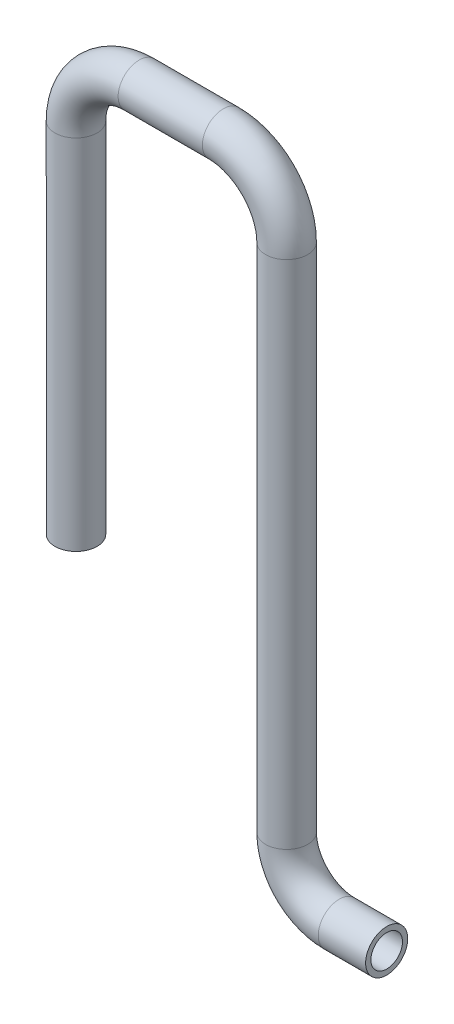
ISO-10303-21;
HEADER;
FILE_DESCRIPTION(('STEP AP214'),'2;1');
FILE_NAME('part.step','',(''),(''),'','','');
FILE_SCHEMA(('AUTOMOTIVE_DESIGN { 1 0 10303 214 1 1 1 1 }'));
ENDSEC;
DATA;
#1=APPLICATION_CONTEXT('core data for automotive mechanical design processes');
#2=APPLICATION_PROTOCOL_DEFINITION('international standard','automotive_design',2000,#1);
#3=PRODUCT_CONTEXT('',#1,'mechanical');
#4=PRODUCT('Part','Part','',(#3));
#5=PRODUCT_RELATED_PRODUCT_CATEGORY('part','',(#4));
#6=PRODUCT_DEFINITION_FORMATION('','',#4);
#7=PRODUCT_DEFINITION_CONTEXT('part definition',#1,'design');
#8=PRODUCT_DEFINITION('design','',#6,#7);
#9=PRODUCT_DEFINITION_SHAPE('','',#8);
#10=(LENGTH_UNIT() NAMED_UNIT(*) SI_UNIT(.MILLI.,.METRE.));
#11=(NAMED_UNIT(*) PLANE_ANGLE_UNIT() SI_UNIT($,.RADIAN.));
#12=(NAMED_UNIT(*) SI_UNIT($,.STERADIAN.) SOLID_ANGLE_UNIT());
#13=UNCERTAINTY_MEASURE_WITH_UNIT(LENGTH_MEASURE(1.E-05),#10,'distance_accuracy_value','');
#14=(GEOMETRIC_REPRESENTATION_CONTEXT(3) GLOBAL_UNCERTAINTY_ASSIGNED_CONTEXT((#13)) GLOBAL_UNIT_ASSIGNED_CONTEXT((#10,
#11,#12)) REPRESENTATION_CONTEXT('',''));
#15=CARTESIAN_POINT('',(0.,0.,0.));
#16=DIRECTION('',(0.,0.,1.));
#17=DIRECTION('',(1.,0.,0.));
#18=AXIS2_PLACEMENT_3D('',#15,#16,#17);
#19=CARTESIAN_POINT('',(59.,21.,35.));
#20=DIRECTION('',(1.,0.,0.));
#21=DIRECTION('',(0.,0.,1.));
#22=AXIS2_PLACEMENT_3D('',#19,#20,#21);
#23=PLANE('',#22);
#24=CARTESIAN_POINT('',(59.,21.,35.));
#25=DIRECTION('',(1.,0.,0.));
#26=DIRECTION('',(0.,0.,1.));
#27=AXIS2_PLACEMENT_3D('',#24,#25,#26);
#28=CIRCLE('',#27,3.);
#29=CARTESIAN_POINT('',(59.,21.,38.));
#30=VERTEX_POINT('',#29);
#31=EDGE_CURVE('E263',#30,#30,#28,.T.);
#32=ORIENTED_EDGE('',*,*,#31,.F.);
#33=EDGE_LOOP('',(#32));
#34=FACE_BOUND('',#33,.T.);
#35=CARTESIAN_POINT('',(59.,21.,35.));
#36=DIRECTION('',(1.,0.,0.));
#37=DIRECTION('',(0.,0.,-1.));
#38=AXIS2_PLACEMENT_3D('',#35,#36,#37);
#39=CIRCLE('',#38,4.);
#40=CARTESIAN_POINT('',(59.,21.,31.));
#41=VERTEX_POINT('',#40);
#42=EDGE_CURVE('E75',#41,#41,#39,.T.);
#43=ORIENTED_EDGE('',*,*,#42,.T.);
#44=EDGE_LOOP('',(#43));
#45=FACE_BOUND('',#44,.T.);
#46=ADVANCED_FACE('F52',(#34,#45),#23,.T.);
#47=CARTESIAN_POINT('',(0.,60.,35.));
#48=DIRECTION('',(0.,1.,0.));
#49=DIRECTION('',(0.,0.,1.));
#50=AXIS2_PLACEMENT_3D('',#47,#48,#49);
#51=PLANE('',#50);
#52=CARTESIAN_POINT('',(0.,60.,35.));
#53=DIRECTION('',(0.,1.,0.));
#54=DIRECTION('',(0.,0.,1.));
#55=AXIS2_PLACEMENT_3D('',#52,#53,#54);
#56=CIRCLE('',#55,3.);
#57=CARTESIAN_POINT('',(0.,60.,38.));
#58=VERTEX_POINT('',#57);
#59=EDGE_CURVE('E73',#58,#58,#56,.T.);
#60=ORIENTED_EDGE('',*,*,#59,.T.);
#61=EDGE_LOOP('',(#60));
#62=FACE_BOUND('',#61,.T.);
#63=CARTESIAN_POINT('',(0.,60.,35.));
#64=DIRECTION('',(0.,1.,0.));
#65=DIRECTION('',(0.,0.,1.));
#66=AXIS2_PLACEMENT_3D('',#63,#64,#65);
#67=CIRCLE('',#66,4.);
#68=CARTESIAN_POINT('',(0.,60.,39.));
#69=VERTEX_POINT('',#68);
#70=EDGE_CURVE('E11',#69,#69,#67,.T.);
#71=ORIENTED_EDGE('',*,*,#70,.F.);
#72=EDGE_LOOP('',(#71));
#73=FACE_BOUND('',#72,.T.);
#74=ADVANCED_FACE('F149',(#62,#73),#51,.F.);
#75=CARTESIAN_POINT('',(59.,21.,35.));
#76=DIRECTION('',(-1.,0.,0.));
#77=DIRECTION('',(0.,0.,1.));
#78=AXIS2_PLACEMENT_3D('',#75,#76,#77);
#79=CYLINDRICAL_SURFACE('',#78,4.);
#80=CARTESIAN_POINT('',(50.,21.,35.));
#81=DIRECTION('',(-1.,0.,0.));
#82=DIRECTION('',(0.,0.,1.));
#83=AXIS2_PLACEMENT_3D('',#80,#81,#82);
#84=CIRCLE('',#83,4.);
#85=CARTESIAN_POINT('',(50.,17.,35.));
#86=VERTEX_POINT('',#85);
#87=EDGE_CURVE('E74',#86,#86,#84,.F.);
#88=ORIENTED_EDGE('',*,*,#87,.T.);
#89=EDGE_LOOP('',(#88));
#90=FACE_BOUND('',#89,.T.);
#91=ORIENTED_EDGE('',*,*,#42,.F.);
#92=EDGE_LOOP('',(#91));
#93=FACE_BOUND('',#92,.T.);
#94=ADVANCED_FACE('F155',(#90,#93),#79,.T.);
#95=CARTESIAN_POINT('',(50.,31.,35.));
#96=DIRECTION('',(0.,0.,-1.));
#97=DIRECTION('',(-1.,0.,0.));
#98=AXIS2_PLACEMENT_3D('',#95,#96,#97);
#99=TOROIDAL_SURFACE('',#98,10.,4.);
#100=CARTESIAN_POINT('',(40.,31.,35.));
#101=DIRECTION('',(0.,-1.,0.));
#102=DIRECTION('',(0.,0.,-1.));
#103=AXIS2_PLACEMENT_3D('',#100,#101,#102);
#104=CIRCLE('',#103,4.);
#105=CARTESIAN_POINT('',(36.,31.,35.));
#106=VERTEX_POINT('',#105);
#107=EDGE_CURVE('E78',#106,#106,#104,.T.);
#108=CARTESIAN_POINT('',(50.,31.,35.));
#109=DIRECTION('',(0.,0.,-1.));
#110=DIRECTION('',(-1.,0.,0.));
#111=AXIS2_PLACEMENT_3D('',#108,#109,#110);
#112=CIRCLE('',#111,14.);
#113=EDGE_CURVE('',#86,#106,#112,.T.);
#114=ORIENTED_EDGE('',*,*,#87,.F.);
#115=ORIENTED_EDGE('',*,*,#107,.T.);
#116=ORIENTED_EDGE('',*,*,#113,.T.);
#117=ORIENTED_EDGE('',*,*,#113,.F.);
#118=EDGE_LOOP('',(#114,#116,#115,#117));
#119=FACE_BOUND('',#118,.T.);
#120=ADVANCED_FACE('F158',(#119),#99,.T.);
#121=CARTESIAN_POINT('',(40.,31.,35.));
#122=DIRECTION('',(0.,1.,0.));
#123=DIRECTION('',(0.,0.,1.));
#124=AXIS2_PLACEMENT_3D('',#121,#122,#123);
#125=CYLINDRICAL_SURFACE('',#124,4.);
#126=CARTESIAN_POINT('',(40.,128.,35.));
#127=DIRECTION('',(0.,1.,0.));
#128=DIRECTION('',(0.,0.,1.));
#129=AXIS2_PLACEMENT_3D('',#126,#127,#128);
#130=CIRCLE('',#129,4.);
#131=CARTESIAN_POINT('',(44.,128.,35.));
#132=VERTEX_POINT('',#131);
#133=EDGE_CURVE('E91',#132,#132,#130,.F.);
#134=ORIENTED_EDGE('',*,*,#133,.T.);
#135=EDGE_LOOP('',(#134));
#136=FACE_BOUND('',#135,.T.);
#137=ORIENTED_EDGE('',*,*,#107,.F.);
#138=EDGE_LOOP('',(#137));
#139=FACE_BOUND('',#138,.T.);
#140=ADVANCED_FACE('F109',(#136,#139),#125,.T.);
#141=CARTESIAN_POINT('',(28.,128.,35.));
#142=DIRECTION('',(0.,0.,1.));
#143=DIRECTION('',(1.,0.,0.));
#144=AXIS2_PLACEMENT_3D('',#141,#142,#143);
#145=TOROIDAL_SURFACE('',#144,12.,4.);
#146=CARTESIAN_POINT('',(28.,140.,35.));
#147=DIRECTION('',(1.,0.,0.));
#148=DIRECTION('',(0.,1.,0.));
#149=AXIS2_PLACEMENT_3D('',#146,#147,#148);
#150=CIRCLE('',#149,4.);
#151=CARTESIAN_POINT('',(28.,144.,35.));
#152=VERTEX_POINT('',#151);
#153=EDGE_CURVE('E67',#152,#152,#150,.T.);
#154=CARTESIAN_POINT('',(28.,128.,35.));
#155=DIRECTION('',(0.,0.,1.));
#156=DIRECTION('',(1.,0.,0.));
#157=AXIS2_PLACEMENT_3D('',#154,#155,#156);
#158=CIRCLE('',#157,16.);
#159=EDGE_CURVE('',#132,#152,#158,.T.);
#160=ORIENTED_EDGE('',*,*,#133,.F.);
#161=ORIENTED_EDGE('',*,*,#153,.T.);
#162=ORIENTED_EDGE('',*,*,#159,.T.);
#163=ORIENTED_EDGE('',*,*,#159,.F.);
#164=EDGE_LOOP('',(#160,#162,#161,#163));
#165=FACE_BOUND('',#164,.T.);
#166=ADVANCED_FACE('F98',(#165),#145,.T.);
#167=CARTESIAN_POINT('',(28.,140.,35.));
#168=DIRECTION('',(-1.,0.,0.));
#169=DIRECTION('',(0.,0.,1.));
#170=AXIS2_PLACEMENT_3D('',#167,#168,#169);
#171=CYLINDRICAL_SURFACE('',#170,4.);
#172=CARTESIAN_POINT('',(12.,140.,35.));
#173=DIRECTION('',(-1.,0.,0.));
#174=DIRECTION('',(0.,0.,1.));
#175=AXIS2_PLACEMENT_3D('',#172,#173,#174);
#176=CIRCLE('',#175,4.);
#177=CARTESIAN_POINT('',(12.,144.,35.));
#178=VERTEX_POINT('',#177);
#179=EDGE_CURVE('E63',#178,#178,#176,.F.);
#180=ORIENTED_EDGE('',*,*,#179,.T.);
#181=EDGE_LOOP('',(#180));
#182=FACE_BOUND('',#181,.T.);
#183=ORIENTED_EDGE('',*,*,#153,.F.);
#184=EDGE_LOOP('',(#183));
#185=FACE_BOUND('',#184,.T.);
#186=ADVANCED_FACE('F101',(#182,#185),#171,.T.);
#187=CARTESIAN_POINT('',(12.,128.,35.));
#188=DIRECTION('',(0.,0.,1.));
#189=DIRECTION('',(1.,0.,0.));
#190=AXIS2_PLACEMENT_3D('',#187,#188,#189);
#191=TOROIDAL_SURFACE('',#190,12.,4.);
#192=CARTESIAN_POINT('',(0.,128.,35.));
#193=DIRECTION('',(0.,1.,0.));
#194=DIRECTION('',(-1.,0.,0.));
#195=AXIS2_PLACEMENT_3D('',#192,#193,#194);
#196=CIRCLE('',#195,4.);
#197=CARTESIAN_POINT('',(-4.00000000000001,128.,35.));
#198=VERTEX_POINT('',#197);
#199=EDGE_CURVE('E58',#198,#198,#196,.T.);
#200=CARTESIAN_POINT('',(12.,128.,35.));
#201=DIRECTION('',(0.,0.,1.));
#202=DIRECTION('',(1.,0.,0.));
#203=AXIS2_PLACEMENT_3D('',#200,#201,#202);
#204=CIRCLE('',#203,16.);
#205=EDGE_CURVE('',#178,#198,#204,.T.);
#206=ORIENTED_EDGE('',*,*,#179,.F.);
#207=ORIENTED_EDGE('',*,*,#199,.T.);
#208=ORIENTED_EDGE('',*,*,#205,.T.);
#209=ORIENTED_EDGE('',*,*,#205,.F.);
#210=EDGE_LOOP('',(#206,#208,#207,#209));
#211=FACE_BOUND('',#210,.T.);
#212=ADVANCED_FACE('F103',(#211),#191,.T.);
#213=CARTESIAN_POINT('',(0.,128.,35.));
#214=DIRECTION('',(0.,-1.,0.));
#215=DIRECTION('',(0.,0.,-1.));
#216=AXIS2_PLACEMENT_3D('',#213,#214,#215);
#217=CYLINDRICAL_SURFACE('',#216,4.);
#218=ORIENTED_EDGE('',*,*,#70,.T.);
#219=EDGE_LOOP('',(#218));
#220=FACE_BOUND('',#219,.T.);
#221=ORIENTED_EDGE('',*,*,#199,.F.);
#222=EDGE_LOOP('',(#221));
#223=FACE_BOUND('',#222,.T.);
#224=ADVANCED_FACE('F54',(#220,#223),#217,.T.);
#225=CARTESIAN_POINT('',(59.,21.,35.));
#226=DIRECTION('',(-1.,0.,0.));
#227=DIRECTION('',(0.,0.,1.));
#228=AXIS2_PLACEMENT_3D('',#225,#226,#227);
#229=CYLINDRICAL_SURFACE('',#228,3.);
#230=CARTESIAN_POINT('',(50.,21.,35.));
#231=DIRECTION('',(1.,0.,0.));
#232=DIRECTION('',(0.,0.,1.));
#233=AXIS2_PLACEMENT_3D('',#230,#231,#232);
#234=CIRCLE('',#233,3.);
#235=CARTESIAN_POINT('',(50.,18.,35.));
#236=VERTEX_POINT('',#235);
#237=EDGE_CURVE('E262',#236,#236,#234,.T.);
#238=ORIENTED_EDGE('',*,*,#237,.F.);
#239=EDGE_LOOP('',(#238));
#240=FACE_BOUND('',#239,.T.);
#241=ORIENTED_EDGE('',*,*,#31,.T.);
#242=EDGE_LOOP('',(#241));
#243=FACE_BOUND('',#242,.T.);
#244=ADVANCED_FACE('F114',(#240,#243),#229,.F.);
#245=CARTESIAN_POINT('',(50.,31.,35.));
#246=DIRECTION('',(0.,0.,-1.));
#247=DIRECTION('',(-1.,0.,0.));
#248=AXIS2_PLACEMENT_3D('',#245,#246,#247);
#249=TOROIDAL_SURFACE('',#248,10.,3.);
#250=CARTESIAN_POINT('',(40.,31.,35.));
#251=DIRECTION('',(0.,-1.,0.));
#252=DIRECTION('',(0.,0.,1.));
#253=AXIS2_PLACEMENT_3D('',#250,#251,#252);
#254=CIRCLE('',#253,3.);
#255=CARTESIAN_POINT('',(37.,31.,35.));
#256=VERTEX_POINT('',#255);
#257=EDGE_CURVE('E270',#256,#256,#254,.T.);
#258=CARTESIAN_POINT('',(50.,31.,35.));
#259=DIRECTION('',(0.,0.,-1.));
#260=DIRECTION('',(-1.,0.,0.));
#261=AXIS2_PLACEMENT_3D('',#258,#259,#260);
#262=CIRCLE('',#261,13.);
#263=EDGE_CURVE('',#236,#256,#262,.T.);
#264=ORIENTED_EDGE('',*,*,#237,.T.);
#265=ORIENTED_EDGE('',*,*,#257,.F.);
#266=ORIENTED_EDGE('',*,*,#263,.T.);
#267=ORIENTED_EDGE('',*,*,#263,.F.);
#268=EDGE_LOOP('',(#264,#266,#265,#267));
#269=FACE_BOUND('',#268,.T.);
#270=ADVANCED_FACE('F120',(#269),#249,.F.);
#271=CARTESIAN_POINT('',(40.,31.,35.));
#272=DIRECTION('',(0.,1.,0.));
#273=DIRECTION('',(0.,0.,1.));
#274=AXIS2_PLACEMENT_3D('',#271,#272,#273);
#275=CYLINDRICAL_SURFACE('',#274,3.);
#276=CARTESIAN_POINT('',(40.,128.,35.));
#277=DIRECTION('',(0.,-1.,0.));
#278=DIRECTION('',(0.,0.,1.));
#279=AXIS2_PLACEMENT_3D('',#276,#277,#278);
#280=CIRCLE('',#279,3.);
#281=CARTESIAN_POINT('',(43.,128.,35.));
#282=VERTEX_POINT('',#281);
#283=EDGE_CURVE('E275',#282,#282,#280,.T.);
#284=ORIENTED_EDGE('',*,*,#283,.F.);
#285=EDGE_LOOP('',(#284));
#286=FACE_BOUND('',#285,.T.);
#287=ORIENTED_EDGE('',*,*,#257,.T.);
#288=EDGE_LOOP('',(#287));
#289=FACE_BOUND('',#288,.T.);
#290=ADVANCED_FACE('F122',(#286,#289),#275,.F.);
#291=CARTESIAN_POINT('',(28.,128.,35.));
#292=DIRECTION('',(0.,0.,1.));
#293=DIRECTION('',(1.,0.,0.));
#294=AXIS2_PLACEMENT_3D('',#291,#292,#293);
#295=TOROIDAL_SURFACE('',#294,12.,3.);
#296=CARTESIAN_POINT('',(28.,140.,35.));
#297=DIRECTION('',(1.,0.,0.));
#298=DIRECTION('',(0.,0.,1.));
#299=AXIS2_PLACEMENT_3D('',#296,#297,#298);
#300=CIRCLE('',#299,3.);
#301=CARTESIAN_POINT('',(28.,143.,35.));
#302=VERTEX_POINT('',#301);
#303=EDGE_CURVE('E274',#302,#302,#300,.T.);
#304=CARTESIAN_POINT('',(28.,128.,35.));
#305=DIRECTION('',(0.,0.,1.));
#306=DIRECTION('',(1.,0.,0.));
#307=AXIS2_PLACEMENT_3D('',#304,#305,#306);
#308=CIRCLE('',#307,15.);
#309=EDGE_CURVE('',#282,#302,#308,.T.);
#310=ORIENTED_EDGE('',*,*,#283,.T.);
#311=ORIENTED_EDGE('',*,*,#303,.F.);
#312=ORIENTED_EDGE('',*,*,#309,.T.);
#313=ORIENTED_EDGE('',*,*,#309,.F.);
#314=EDGE_LOOP('',(#310,#312,#311,#313));
#315=FACE_BOUND('',#314,.T.);
#316=ADVANCED_FACE('F135',(#315),#295,.F.);
#317=CARTESIAN_POINT('',(28.,140.,35.));
#318=DIRECTION('',(-1.,0.,0.));
#319=DIRECTION('',(0.,0.,1.));
#320=AXIS2_PLACEMENT_3D('',#317,#318,#319);
#321=CYLINDRICAL_SURFACE('',#320,3.);
#322=CARTESIAN_POINT('',(12.,140.,35.));
#323=DIRECTION('',(1.,0.,0.));
#324=DIRECTION('',(0.,0.,1.));
#325=AXIS2_PLACEMENT_3D('',#322,#323,#324);
#326=CIRCLE('',#325,3.);
#327=CARTESIAN_POINT('',(12.,143.,35.));
#328=VERTEX_POINT('',#327);
#329=EDGE_CURVE('E87',#328,#328,#326,.T.);
#330=ORIENTED_EDGE('',*,*,#329,.F.);
#331=EDGE_LOOP('',(#330));
#332=FACE_BOUND('',#331,.T.);
#333=ORIENTED_EDGE('',*,*,#303,.T.);
#334=EDGE_LOOP('',(#333));
#335=FACE_BOUND('',#334,.T.);
#336=ADVANCED_FACE('F136',(#332,#335),#321,.F.);
#337=CARTESIAN_POINT('',(12.,128.,35.));
#338=DIRECTION('',(0.,0.,1.));
#339=DIRECTION('',(1.,0.,0.));
#340=AXIS2_PLACEMENT_3D('',#337,#338,#339);
#341=TOROIDAL_SURFACE('',#340,12.,3.);
#342=CARTESIAN_POINT('',(-1.43982048506075E-13,128.,35.));
#343=DIRECTION('',(0.,1.,0.));
#344=DIRECTION('',(0.,0.,1.));
#345=AXIS2_PLACEMENT_3D('',#342,#343,#344);
#346=CIRCLE('',#345,3.);
#347=CARTESIAN_POINT('',(-3.00000000000001,128.,35.));
#348=VERTEX_POINT('',#347);
#349=EDGE_CURVE('E85',#348,#348,#346,.T.);
#350=CARTESIAN_POINT('',(12.,128.,35.));
#351=DIRECTION('',(0.,0.,1.));
#352=DIRECTION('',(1.,0.,0.));
#353=AXIS2_PLACEMENT_3D('',#350,#351,#352);
#354=CIRCLE('',#353,15.);
#355=EDGE_CURVE('',#328,#348,#354,.T.);
#356=ORIENTED_EDGE('',*,*,#329,.T.);
#357=ORIENTED_EDGE('',*,*,#349,.F.);
#358=ORIENTED_EDGE('',*,*,#355,.T.);
#359=ORIENTED_EDGE('',*,*,#355,.F.);
#360=EDGE_LOOP('',(#356,#358,#357,#359));
#361=FACE_BOUND('',#360,.T.);
#362=ADVANCED_FACE('F139',(#361),#341,.F.);
#363=CARTESIAN_POINT('',(0.,128.,35.));
#364=DIRECTION('',(0.,-1.,0.));
#365=DIRECTION('',(0.,0.,-1.));
#366=AXIS2_PLACEMENT_3D('',#363,#364,#365);
#367=CYLINDRICAL_SURFACE('',#366,3.);
#368=ORIENTED_EDGE('',*,*,#59,.F.);
#369=EDGE_LOOP('',(#368));
#370=FACE_BOUND('',#369,.T.);
#371=ORIENTED_EDGE('',*,*,#349,.T.);
#372=EDGE_LOOP('',(#371));
#373=FACE_BOUND('',#372,.T.);
#374=ADVANCED_FACE('F145',(#370,#373),#367,.F.);
#375=CLOSED_SHELL('',(#46,#74,#94,#120,#140,#166,#186,#212,#224,#244,#270,#290,#316,#336,#362,#374));
#376=MANIFOLD_SOLID_BREP('B2',#375);
#377=ADVANCED_BREP_SHAPE_REPRESENTATION('',(#18,#376),#14);
#378=SHAPE_DEFINITION_REPRESENTATION(#9,#377);
ENDSEC;
END-ISO-10303-21;
